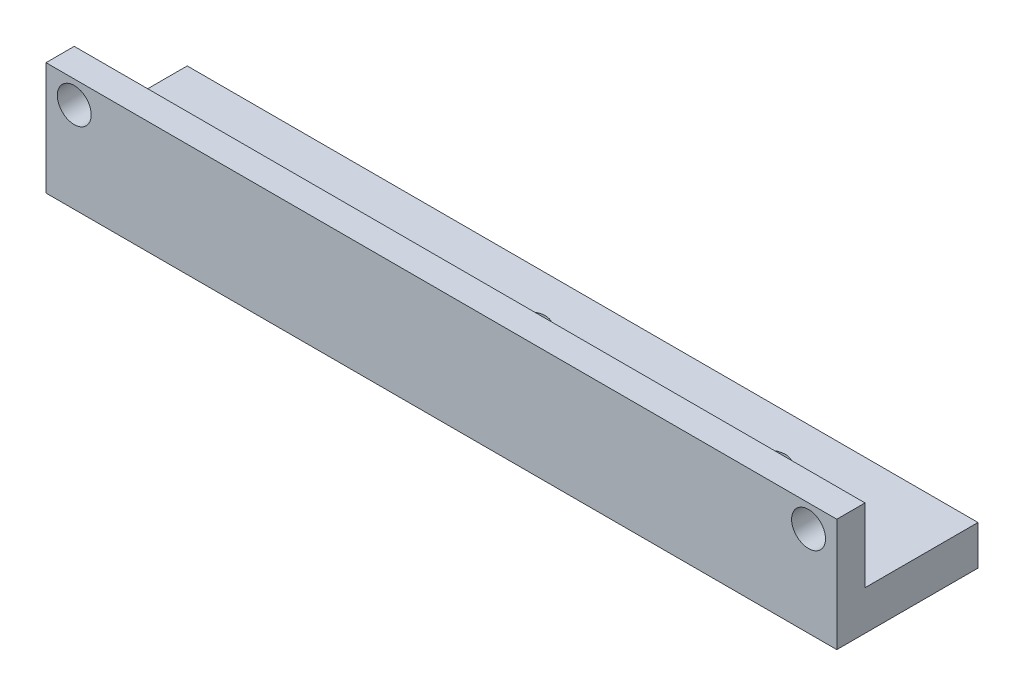
ISO-10303-21;
HEADER;
FILE_DESCRIPTION(('STEP AP214'),'2;1');
FILE_NAME('part.step','',(''),(''),'','','');
FILE_SCHEMA(('AUTOMOTIVE_DESIGN { 1 0 10303 214 1 1 1 1 }'));
ENDSEC;
DATA;
#1=APPLICATION_CONTEXT('core data for automotive mechanical design processes');
#2=APPLICATION_PROTOCOL_DEFINITION('international standard','automotive_design',2000,#1);
#3=PRODUCT_CONTEXT('',#1,'mechanical');
#4=PRODUCT('Part','Part','',(#3));
#5=PRODUCT_RELATED_PRODUCT_CATEGORY('part','',(#4));
#6=PRODUCT_DEFINITION_FORMATION('','',#4);
#7=PRODUCT_DEFINITION_CONTEXT('part definition',#1,'design');
#8=PRODUCT_DEFINITION('design','',#6,#7);
#9=PRODUCT_DEFINITION_SHAPE('','',#8);
#10=(LENGTH_UNIT() NAMED_UNIT(*) SI_UNIT(.MILLI.,.METRE.));
#11=(NAMED_UNIT(*) PLANE_ANGLE_UNIT() SI_UNIT($,.RADIAN.));
#12=(NAMED_UNIT(*) SI_UNIT($,.STERADIAN.) SOLID_ANGLE_UNIT());
#13=UNCERTAINTY_MEASURE_WITH_UNIT(LENGTH_MEASURE(1.E-05),#10,'distance_accuracy_value','');
#14=(GEOMETRIC_REPRESENTATION_CONTEXT(3) GLOBAL_UNCERTAINTY_ASSIGNED_CONTEXT((#13)) GLOBAL_UNIT_ASSIGNED_CONTEXT((#10,
#11,#12)) REPRESENTATION_CONTEXT('',''));
#15=CARTESIAN_POINT('',(0.,0.,0.));
#16=DIRECTION('',(0.,0.,1.));
#17=DIRECTION('',(1.,0.,0.));
#18=AXIS2_PLACEMENT_3D('',#15,#16,#17);
#19=CARTESIAN_POINT('',(0.,20.,-25.));
#20=DIRECTION('',(0.,0.,1.));
#21=DIRECTION('',(-1.,0.,0.));
#22=AXIS2_PLACEMENT_3D('',#19,#20,#21);
#23=PLANE('',#22);
#24=DIRECTION('',(1.,0.,0.));
#25=VECTOR('',#24,1.);
#26=CARTESIAN_POINT('',(-74.,-0.999999999999999,-25.));
#27=LINE('',#26,#25);
#28=CARTESIAN_POINT('',(-74.,-0.999999999999997,-25.));
#29=VERTEX_POINT('',#28);
#30=CARTESIAN_POINT('',(-66.,-0.999999999999999,-25.));
#31=VERTEX_POINT('',#30);
#32=EDGE_CURVE('E161',#29,#31,#27,.T.);
#33=ORIENTED_EDGE('',*,*,#32,.T.);
#34=DIRECTION('',(0.,1.,0.));
#35=VECTOR('',#34,1.);
#36=CARTESIAN_POINT('',(-66.,4.,-25.));
#37=LINE('',#36,#35);
#38=CARTESIAN_POINT('',(-66.,4.,-25.));
#39=VERTEX_POINT('',#38);
#40=EDGE_CURVE('E174',#31,#39,#37,.T.);
#41=ORIENTED_EDGE('',*,*,#40,.T.);
#42=DIRECTION('',(-1.,0.,0.));
#43=VECTOR('',#42,1.);
#44=CARTESIAN_POINT('',(-74.,4.,-25.));
#45=LINE('',#44,#43);
#46=CARTESIAN_POINT('',(-74.,4.,-25.));
#47=VERTEX_POINT('',#46);
#48=EDGE_CURVE('E170',#39,#47,#45,.T.);
#49=ORIENTED_EDGE('',*,*,#48,.T.);
#50=DIRECTION('',(0.,-1.,0.));
#51=VECTOR('',#50,1.);
#52=CARTESIAN_POINT('',(-74.,4.,-25.));
#53=LINE('',#52,#51);
#54=EDGE_CURVE('E184',#47,#29,#53,.T.);
#55=ORIENTED_EDGE('',*,*,#54,.T.);
#56=EDGE_LOOP('',(#33,#41,#49,#55));
#57=FACE_BOUND('',#56,.T.);
#58=DIRECTION('',(1.,0.,0.));
#59=VECTOR('',#58,1.);
#60=CARTESIAN_POINT('',(-31.5,-0.999999999999999,-25.));
#61=LINE('',#60,#59);
#62=CARTESIAN_POINT('',(-31.5,-0.999999999999997,-25.));
#63=VERTEX_POINT('',#62);
#64=CARTESIAN_POINT('',(-23.5,-0.999999999999999,-25.));
#65=VERTEX_POINT('',#64);
#66=EDGE_CURVE('E218',#63,#65,#61,.T.);
#67=ORIENTED_EDGE('',*,*,#66,.T.);
#68=DIRECTION('',(0.,1.,0.));
#69=VECTOR('',#68,1.);
#70=CARTESIAN_POINT('',(-23.5,4.,-25.));
#71=LINE('',#70,#69);
#72=CARTESIAN_POINT('',(-23.5,4.,-25.));
#73=VERTEX_POINT('',#72);
#74=EDGE_CURVE('E222',#65,#73,#71,.T.);
#75=ORIENTED_EDGE('',*,*,#74,.T.);
#76=DIRECTION('',(-1.,0.,0.));
#77=VECTOR('',#76,1.);
#78=CARTESIAN_POINT('',(-31.5,4.,-25.));
#79=LINE('',#78,#77);
#80=CARTESIAN_POINT('',(-31.5,4.,-25.));
#81=VERTEX_POINT('',#80);
#82=EDGE_CURVE('E205',#73,#81,#79,.T.);
#83=ORIENTED_EDGE('',*,*,#82,.T.);
#84=DIRECTION('',(0.,-1.,0.));
#85=VECTOR('',#84,1.);
#86=CARTESIAN_POINT('',(-31.5,4.,-25.));
#87=LINE('',#86,#85);
#88=EDGE_CURVE('E215',#81,#63,#87,.T.);
#89=ORIENTED_EDGE('',*,*,#88,.T.);
#90=EDGE_LOOP('',(#67,#75,#83,#89));
#91=FACE_BOUND('',#90,.T.);
#92=DIRECTION('',(1.,0.,0.));
#93=VECTOR('',#92,1.);
#94=CARTESIAN_POINT('',(0.,5.,-25.));
#95=LINE('',#94,#93);
#96=CARTESIAN_POINT('',(-140.,5.,-25.));
#97=VERTEX_POINT('',#96);
#98=CARTESIAN_POINT('',(0.,5.,-25.));
#99=VERTEX_POINT('',#98);
#100=EDGE_CURVE('E289',#97,#99,#95,.T.);
#101=ORIENTED_EDGE('',*,*,#100,.T.);
#102=DIRECTION('',(0.,-1.,0.));
#103=VECTOR('',#102,1.);
#104=CARTESIAN_POINT('',(0.,20.,-25.));
#105=LINE('',#104,#103);
#106=CARTESIAN_POINT('',(0.,-2.,-25.));
#107=VERTEX_POINT('',#106);
#108=EDGE_CURVE('E298',#99,#107,#105,.T.);
#109=ORIENTED_EDGE('',*,*,#108,.T.);
#110=DIRECTION('',(-1.,0.,0.));
#111=VECTOR('',#110,1.);
#112=CARTESIAN_POINT('',(-140.,-2.,-25.));
#113=LINE('',#112,#111);
#114=CARTESIAN_POINT('',(-140.,-2.,-25.));
#115=VERTEX_POINT('',#114);
#116=EDGE_CURVE('E249',#107,#115,#113,.T.);
#117=ORIENTED_EDGE('',*,*,#116,.T.);
#118=DIRECTION('',(0.,-1.,0.));
#119=VECTOR('',#118,1.);
#120=CARTESIAN_POINT('',(-140.,20.,-25.));
#121=LINE('',#120,#119);
#122=EDGE_CURVE('E305',#97,#115,#121,.T.);
#123=ORIENTED_EDGE('',*,*,#122,.F.);
#124=EDGE_LOOP('',(#101,#109,#117,#123));
#125=FACE_BOUND('',#124,.T.);
#126=ADVANCED_FACE('F41',(#57,#91,#125),#23,.F.);
#127=CARTESIAN_POINT('',(0.,20.,0.));
#128=DIRECTION('',(-1.,0.,0.));
#129=DIRECTION('',(0.,0.,-1.));
#130=AXIS2_PLACEMENT_3D('',#127,#128,#129);
#131=PLANE('',#130);
#132=DIRECTION('',(0.,-1.,0.));
#133=VECTOR('',#132,1.);
#134=CARTESIAN_POINT('',(0.,20.,0.));
#135=LINE('',#134,#133);
#136=CARTESIAN_POINT('',(0.,18.,0.));
#137=VERTEX_POINT('',#136);
#138=CARTESIAN_POINT('',(0.,-2.,0.));
#139=VERTEX_POINT('',#138);
#140=EDGE_CURVE('E11',#137,#139,#135,.T.);
#141=ORIENTED_EDGE('',*,*,#140,.T.);
#142=DIRECTION('',(0.,0.,-1.));
#143=VECTOR('',#142,1.);
#144=CARTESIAN_POINT('',(0.,-2.,0.));
#145=LINE('',#144,#143);
#146=EDGE_CURVE('E246',#139,#107,#145,.T.);
#147=ORIENTED_EDGE('',*,*,#146,.T.);
#148=ORIENTED_EDGE('',*,*,#108,.F.);
#149=DIRECTION('',(0.,0.,1.));
#150=VECTOR('',#149,1.);
#151=CARTESIAN_POINT('',(0.,5.,-25.));
#152=LINE('',#151,#150);
#153=CARTESIAN_POINT('',(0.,5.,-5.));
#154=VERTEX_POINT('',#153);
#155=EDGE_CURVE('E278',#99,#154,#152,.T.);
#156=ORIENTED_EDGE('',*,*,#155,.T.);
#157=DIRECTION('',(0.,1.,0.));
#158=VECTOR('',#157,1.);
#159=CARTESIAN_POINT('',(0.,5.,-5.));
#160=LINE('',#159,#158);
#161=CARTESIAN_POINT('',(0.,18.,-5.));
#162=VERTEX_POINT('',#161);
#163=EDGE_CURVE('E293',#154,#162,#160,.T.);
#164=ORIENTED_EDGE('',*,*,#163,.T.);
#165=DIRECTION('',(0.,0.,-1.));
#166=VECTOR('',#165,1.);
#167=CARTESIAN_POINT('',(0.,18.,10.));
#168=LINE('',#167,#166);
#169=EDGE_CURVE('E257',#137,#162,#168,.T.);
#170=ORIENTED_EDGE('',*,*,#169,.F.);
#171=EDGE_LOOP('',(#141,#147,#148,#156,#164,#170));
#172=FACE_BOUND('',#171,.T.);
#173=ADVANCED_FACE('F43',(#172),#131,.F.);
#174=CARTESIAN_POINT('',(0.,20.,0.));
#175=DIRECTION('',(0.,0.,-1.));
#176=DIRECTION('',(1.,0.,0.));
#177=AXIS2_PLACEMENT_3D('',#174,#175,#176);
#178=PLANE('',#177);
#179=CARTESIAN_POINT('',(-5.,14.,0.));
#180=DIRECTION('',(0.,0.,-1.));
#181=DIRECTION('',(-1.,0.,0.));
#182=AXIS2_PLACEMENT_3D('',#179,#180,#181);
#183=CIRCLE('',#182,3.);
#184=CARTESIAN_POINT('',(-8.,14.,0.));
#185=VERTEX_POINT('',#184);
#186=EDGE_CURVE('E268',#185,#185,#183,.T.);
#187=ORIENTED_EDGE('',*,*,#186,.T.);
#188=EDGE_LOOP('',(#187));
#189=FACE_BOUND('',#188,.T.);
#190=CARTESIAN_POINT('',(-135.,14.,0.));
#191=DIRECTION('',(0.,0.,-1.));
#192=DIRECTION('',(-1.,0.,0.));
#193=AXIS2_PLACEMENT_3D('',#190,#191,#192);
#194=CIRCLE('',#193,2.99999999999999);
#195=CARTESIAN_POINT('',(-138.,14.,0.));
#196=VERTEX_POINT('',#195);
#197=EDGE_CURVE('E273',#196,#196,#194,.T.);
#198=ORIENTED_EDGE('',*,*,#197,.T.);
#199=EDGE_LOOP('',(#198));
#200=FACE_BOUND('',#199,.T.);
#201=DIRECTION('',(0.,-1.,0.));
#202=VECTOR('',#201,1.);
#203=CARTESIAN_POINT('',(-140.,20.,0.));
#204=LINE('',#203,#202);
#205=CARTESIAN_POINT('',(-140.,18.,0.));
#206=VERTEX_POINT('',#205);
#207=CARTESIAN_POINT('',(-140.,-2.,0.));
#208=VERTEX_POINT('',#207);
#209=EDGE_CURVE('E51',#206,#208,#204,.T.);
#210=ORIENTED_EDGE('',*,*,#209,.T.);
#211=DIRECTION('',(1.,0.,0.));
#212=VECTOR('',#211,1.);
#213=CARTESIAN_POINT('',(-140.,-2.,0.));
#214=LINE('',#213,#212);
#215=EDGE_CURVE('E242',#208,#139,#214,.T.);
#216=ORIENTED_EDGE('',*,*,#215,.T.);
#217=ORIENTED_EDGE('',*,*,#140,.F.);
#218=DIRECTION('',(1.,0.,0.));
#219=VECTOR('',#218,1.);
#220=CARTESIAN_POINT('',(0.,18.,0.));
#221=LINE('',#220,#219);
#222=EDGE_CURVE('E261',#206,#137,#221,.T.);
#223=ORIENTED_EDGE('',*,*,#222,.F.);
#224=EDGE_LOOP('',(#210,#216,#217,#223));
#225=FACE_BOUND('',#224,.T.);
#226=ADVANCED_FACE('F372',(#189,#200,#225),#178,.F.);
#227=CARTESIAN_POINT('',(-140.,20.,0.));
#228=DIRECTION('',(1.,0.,0.));
#229=DIRECTION('',(0.,0.,1.));
#230=AXIS2_PLACEMENT_3D('',#227,#228,#229);
#231=PLANE('',#230);
#232=DIRECTION('',(0.,1.,0.));
#233=VECTOR('',#232,1.);
#234=CARTESIAN_POINT('',(-140.,5.,-5.));
#235=LINE('',#234,#233);
#236=CARTESIAN_POINT('',(-140.,5.,-5.));
#237=VERTEX_POINT('',#236);
#238=CARTESIAN_POINT('',(-140.,18.,-5.));
#239=VERTEX_POINT('',#238);
#240=EDGE_CURVE('E294',#237,#239,#235,.T.);
#241=ORIENTED_EDGE('',*,*,#240,.F.);
#242=DIRECTION('',(0.,0.,-1.));
#243=VECTOR('',#242,1.);
#244=CARTESIAN_POINT('',(-140.,5.,-25.));
#245=LINE('',#244,#243);
#246=EDGE_CURVE('E286',#237,#97,#245,.T.);
#247=ORIENTED_EDGE('',*,*,#246,.T.);
#248=ORIENTED_EDGE('',*,*,#122,.T.);
#249=DIRECTION('',(0.,0.,1.));
#250=VECTOR('',#249,1.);
#251=CARTESIAN_POINT('',(-140.,-2.,0.));
#252=LINE('',#251,#250);
#253=EDGE_CURVE('E239',#115,#208,#252,.T.);
#254=ORIENTED_EDGE('',*,*,#253,.T.);
#255=ORIENTED_EDGE('',*,*,#209,.F.);
#256=DIRECTION('',(0.,0.,-1.));
#257=VECTOR('',#256,1.);
#258=CARTESIAN_POINT('',(-140.,18.,10.));
#259=LINE('',#258,#257);
#260=EDGE_CURVE('E256',#206,#239,#259,.T.);
#261=ORIENTED_EDGE('',*,*,#260,.T.);
#262=EDGE_LOOP('',(#241,#247,#248,#254,#255,#261));
#263=FACE_BOUND('',#262,.T.);
#264=ADVANCED_FACE('F362',(#263),#231,.F.);
#265=CARTESIAN_POINT('',(0.,5.,-5.));
#266=DIRECTION('',(0.,0.,1.));
#267=DIRECTION('',(-1.,0.,0.));
#268=AXIS2_PLACEMENT_3D('',#265,#266,#267);
#269=PLANE('',#268);
#270=CARTESIAN_POINT('',(-5.,14.,-5.));
#271=DIRECTION('',(0.,0.,-1.));
#272=DIRECTION('',(-1.,0.,0.));
#273=AXIS2_PLACEMENT_3D('',#270,#271,#272);
#274=CIRCLE('',#273,3.);
#275=CARTESIAN_POINT('',(-8.,14.,-5.));
#276=VERTEX_POINT('',#275);
#277=EDGE_CURVE('E283',#276,#276,#274,.T.);
#278=ORIENTED_EDGE('',*,*,#277,.F.);
#279=EDGE_LOOP('',(#278));
#280=FACE_BOUND('',#279,.T.);
#281=CARTESIAN_POINT('',(-135.,14.,-5.));
#282=DIRECTION('',(0.,0.,-1.));
#283=DIRECTION('',(-1.,0.,0.));
#284=AXIS2_PLACEMENT_3D('',#281,#282,#283);
#285=CIRCLE('',#284,2.99999999999999);
#286=CARTESIAN_POINT('',(-138.,14.,-5.));
#287=VERTEX_POINT('',#286);
#288=EDGE_CURVE('E272',#287,#287,#285,.T.);
#289=ORIENTED_EDGE('',*,*,#288,.F.);
#290=EDGE_LOOP('',(#289));
#291=FACE_BOUND('',#290,.T.);
#292=ORIENTED_EDGE('',*,*,#163,.F.);
#293=DIRECTION('',(-1.,0.,0.));
#294=VECTOR('',#293,1.);
#295=CARTESIAN_POINT('',(0.,5.,-5.));
#296=LINE('',#295,#294);
#297=EDGE_CURVE('E282',#154,#237,#296,.T.);
#298=ORIENTED_EDGE('',*,*,#297,.T.);
#299=ORIENTED_EDGE('',*,*,#240,.T.);
#300=DIRECTION('',(1.,0.,0.));
#301=VECTOR('',#300,1.);
#302=CARTESIAN_POINT('',(-140.,18.,-5.));
#303=LINE('',#302,#301);
#304=EDGE_CURVE('E253',#239,#162,#303,.T.);
#305=ORIENTED_EDGE('',*,*,#304,.T.);
#306=EDGE_LOOP('',(#292,#298,#299,#305));
#307=FACE_BOUND('',#306,.T.);
#308=ADVANCED_FACE('F376',(#280,#291,#307),#269,.F.);
#309=CARTESIAN_POINT('',(0.,5.,0.));
#310=DIRECTION('',(0.,1.,0.));
#311=DIRECTION('',(0.,0.,1.));
#312=AXIS2_PLACEMENT_3D('',#309,#310,#311);
#313=PLANE('',#312);
#314=CARTESIAN_POINT('',(-70.,5.,-15.4));
#315=DIRECTION('',(0.,-1.,0.));
#316=DIRECTION('',(0.,0.,1.));
#317=AXIS2_PLACEMENT_3D('',#314,#315,#316);
#318=CIRCLE('',#317,3.00000000000001);
#319=CARTESIAN_POINT('',(-70.,5.,-12.4));
#320=VERTEX_POINT('',#319);
#321=EDGE_CURVE('E277',#320,#320,#318,.T.);
#322=ORIENTED_EDGE('',*,*,#321,.T.);
#323=EDGE_LOOP('',(#322));
#324=FACE_BOUND('',#323,.T.);
#325=CARTESIAN_POINT('',(-27.5,5.,-15.4));
#326=DIRECTION('',(0.,-1.,0.));
#327=DIRECTION('',(0.,0.,1.));
#328=AXIS2_PLACEMENT_3D('',#325,#326,#327);
#329=CIRCLE('',#328,3.);
#330=CARTESIAN_POINT('',(-27.5,5.,-12.4));
#331=VERTEX_POINT('',#330);
#332=EDGE_CURVE('E267',#331,#331,#329,.T.);
#333=ORIENTED_EDGE('',*,*,#332,.T.);
#334=EDGE_LOOP('',(#333));
#335=FACE_BOUND('',#334,.T.);
#336=ORIENTED_EDGE('',*,*,#155,.F.);
#337=ORIENTED_EDGE('',*,*,#100,.F.);
#338=ORIENTED_EDGE('',*,*,#246,.F.);
#339=ORIENTED_EDGE('',*,*,#297,.F.);
#340=EDGE_LOOP('',(#336,#337,#338,#339));
#341=FACE_BOUND('',#340,.T.);
#342=ADVANCED_FACE('F378',(#324,#335,#341),#313,.T.);
#343=CARTESIAN_POINT('',(-135.,14.,-15.));
#344=DIRECTION('',(0.,0.,1.));
#345=DIRECTION('',(-1.,0.,0.));
#346=AXIS2_PLACEMENT_3D('',#343,#344,#345);
#347=CYLINDRICAL_SURFACE('',#346,2.99999999999999);
#348=ORIENTED_EDGE('',*,*,#197,.F.);
#349=EDGE_LOOP('',(#348));
#350=FACE_BOUND('',#349,.T.);
#351=ORIENTED_EDGE('',*,*,#288,.T.);
#352=EDGE_LOOP('',(#351));
#353=FACE_BOUND('',#352,.T.);
#354=ADVANCED_FACE('F380',(#350,#353),#347,.F.);
#355=CARTESIAN_POINT('',(-5.,14.,-15.));
#356=DIRECTION('',(0.,0.,1.));
#357=DIRECTION('',(-1.,0.,0.));
#358=AXIS2_PLACEMENT_3D('',#355,#356,#357);
#359=CYLINDRICAL_SURFACE('',#358,3.);
#360=ORIENTED_EDGE('',*,*,#186,.F.);
#361=EDGE_LOOP('',(#360));
#362=FACE_BOUND('',#361,.T.);
#363=ORIENTED_EDGE('',*,*,#277,.T.);
#364=EDGE_LOOP('',(#363));
#365=FACE_BOUND('',#364,.T.);
#366=ADVANCED_FACE('F387',(#362,#365),#359,.F.);
#367=CARTESIAN_POINT('',(-27.5,0.,-15.4));
#368=DIRECTION('',(0.,1.,0.));
#369=DIRECTION('',(0.,0.,1.));
#370=AXIS2_PLACEMENT_3D('',#367,#368,#369);
#371=CYLINDRICAL_SURFACE('',#370,3.);
#372=CARTESIAN_POINT('',(-27.5,4.,-15.4));
#373=DIRECTION('',(0.,-1.,0.));
#374=DIRECTION('',(0.,0.,1.));
#375=AXIS2_PLACEMENT_3D('',#372,#373,#374);
#376=CIRCLE('',#375,3.);
#377=CARTESIAN_POINT('',(-27.5,4.,-12.4));
#378=VERTEX_POINT('',#377);
#379=EDGE_CURVE('E243',#378,#378,#376,.F.);
#380=ORIENTED_EDGE('',*,*,#379,.F.);
#381=EDGE_LOOP('',(#380));
#382=FACE_BOUND('',#381,.T.);
#383=ORIENTED_EDGE('',*,*,#332,.F.);
#384=EDGE_LOOP('',(#383));
#385=FACE_BOUND('',#384,.T.);
#386=ADVANCED_FACE('F415',(#382,#385),#371,.F.);
#387=CARTESIAN_POINT('',(-70.,0.,-15.4));
#388=DIRECTION('',(0.,1.,0.));
#389=DIRECTION('',(0.,0.,1.));
#390=AXIS2_PLACEMENT_3D('',#387,#388,#389);
#391=CYLINDRICAL_SURFACE('',#390,3.00000000000001);
#392=CARTESIAN_POINT('',(-70.,4.,-15.4));
#393=DIRECTION('',(0.,-1.,0.));
#394=DIRECTION('',(0.,0.,1.));
#395=AXIS2_PLACEMENT_3D('',#392,#393,#394);
#396=CIRCLE('',#395,3.00000000000001);
#397=CARTESIAN_POINT('',(-70.,4.,-12.4));
#398=VERTEX_POINT('',#397);
#399=EDGE_CURVE('E195',#398,#398,#396,.F.);
#400=ORIENTED_EDGE('',*,*,#399,.F.);
#401=EDGE_LOOP('',(#400));
#402=FACE_BOUND('',#401,.T.);
#403=ORIENTED_EDGE('',*,*,#321,.F.);
#404=EDGE_LOOP('',(#403));
#405=FACE_BOUND('',#404,.T.);
#406=ADVANCED_FACE('F421',(#402,#405),#391,.F.);
#407=CARTESIAN_POINT('',(-140.,18.,10.));
#408=DIRECTION('',(0.,-1.,0.));
#409=DIRECTION('',(0.,0.,-1.));
#410=AXIS2_PLACEMENT_3D('',#407,#408,#409);
#411=PLANE('',#410);
#412=ORIENTED_EDGE('',*,*,#260,.F.);
#413=ORIENTED_EDGE('',*,*,#222,.T.);
#414=ORIENTED_EDGE('',*,*,#169,.T.);
#415=ORIENTED_EDGE('',*,*,#304,.F.);
#416=EDGE_LOOP('',(#412,#413,#414,#415));
#417=FACE_BOUND('',#416,.T.);
#418=ADVANCED_FACE('F352',(#417),#411,.F.);
#419=CARTESIAN_POINT('',(0.,-2.,0.));
#420=DIRECTION('',(0.,1.,0.));
#421=DIRECTION('',(0.,0.,1.));
#422=AXIS2_PLACEMENT_3D('',#419,#420,#421);
#423=PLANE('',#422);
#424=CARTESIAN_POINT('',(-27.5,-2.,-15.4));
#425=DIRECTION('',(0.,-1.,0.));
#426=DIRECTION('',(0.,0.,1.));
#427=AXIS2_PLACEMENT_3D('',#424,#425,#426);
#428=CIRCLE('',#427,3.);
#429=CARTESIAN_POINT('',(-27.5,-2.,-12.4));
#430=VERTEX_POINT('',#429);
#431=EDGE_CURVE('E332',#430,#430,#428,.T.);
#432=ORIENTED_EDGE('',*,*,#431,.F.);
#433=EDGE_LOOP('',(#432));
#434=FACE_BOUND('',#433,.T.);
#435=CARTESIAN_POINT('',(-70.,-2.,-15.4));
#436=DIRECTION('',(0.,-1.,0.));
#437=DIRECTION('',(0.,0.,1.));
#438=AXIS2_PLACEMENT_3D('',#435,#436,#437);
#439=CIRCLE('',#438,3.00000000000001);
#440=CARTESIAN_POINT('',(-70.,-2.,-12.4));
#441=VERTEX_POINT('',#440);
#442=EDGE_CURVE('E177',#441,#441,#439,.T.);
#443=ORIENTED_EDGE('',*,*,#442,.F.);
#444=EDGE_LOOP('',(#443));
#445=FACE_BOUND('',#444,.T.);
#446=ORIENTED_EDGE('',*,*,#253,.F.);
#447=ORIENTED_EDGE('',*,*,#116,.F.);
#448=ORIENTED_EDGE('',*,*,#146,.F.);
#449=ORIENTED_EDGE('',*,*,#215,.F.);
#450=EDGE_LOOP('',(#446,#447,#448,#449));
#451=FACE_BOUND('',#450,.T.);
#452=ADVANCED_FACE('F348',(#434,#445,#451),#423,.F.);
#453=CARTESIAN_POINT('',(-74.,4.,-9.));
#454=DIRECTION('',(0.,1.,0.));
#455=DIRECTION('',(0.,0.,1.));
#456=AXIS2_PLACEMENT_3D('',#453,#454,#455);
#457=PLANE('',#456);
#458=ORIENTED_EDGE('',*,*,#48,.F.);
#459=DIRECTION('',(0.,0.,-1.));
#460=VECTOR('',#459,1.);
#461=CARTESIAN_POINT('',(-66.,4.,-9.));
#462=LINE('',#461,#460);
#463=CARTESIAN_POINT('',(-66.,4.,-9.));
#464=VERTEX_POINT('',#463);
#465=EDGE_CURVE('E196',#464,#39,#462,.T.);
#466=ORIENTED_EDGE('',*,*,#465,.F.);
#467=DIRECTION('',(-1.,0.,0.));
#468=VECTOR('',#467,1.);
#469=CARTESIAN_POINT('',(-74.,4.,-9.));
#470=LINE('',#469,#468);
#471=CARTESIAN_POINT('',(-74.,4.,-9.));
#472=VERTEX_POINT('',#471);
#473=EDGE_CURVE('E164',#464,#472,#470,.T.);
#474=ORIENTED_EDGE('',*,*,#473,.T.);
#475=DIRECTION('',(0.,0.,-1.));
#476=VECTOR('',#475,1.);
#477=CARTESIAN_POINT('',(-74.,4.,-9.));
#478=LINE('',#477,#476);
#479=EDGE_CURVE('E167',#472,#47,#478,.T.);
#480=ORIENTED_EDGE('',*,*,#479,.T.);
#481=EDGE_LOOP('',(#458,#466,#474,#480));
#482=FACE_BOUND('',#481,.T.);
#483=ORIENTED_EDGE('',*,*,#399,.T.);
#484=EDGE_LOOP('',(#483));
#485=FACE_BOUND('',#484,.T.);
#486=ADVANCED_FACE('F351',(#482,#485),#457,.F.);
#487=CARTESIAN_POINT('',(-74.,4.,-9.));
#488=DIRECTION('',(-1.,0.,0.));
#489=DIRECTION('',(0.,0.,-1.));
#490=AXIS2_PLACEMENT_3D('',#487,#488,#489);
#491=PLANE('',#490);
#492=ORIENTED_EDGE('',*,*,#54,.F.);
#493=ORIENTED_EDGE('',*,*,#479,.F.);
#494=DIRECTION('',(0.,-1.,0.));
#495=VECTOR('',#494,1.);
#496=CARTESIAN_POINT('',(-74.,4.,-9.));
#497=LINE('',#496,#495);
#498=CARTESIAN_POINT('',(-74.,-0.999999999999999,-9.));
#499=VERTEX_POINT('',#498);
#500=EDGE_CURVE('E151',#472,#499,#497,.T.);
#501=ORIENTED_EDGE('',*,*,#500,.T.);
#502=DIRECTION('',(0.,0.,-1.));
#503=VECTOR('',#502,1.);
#504=CARTESIAN_POINT('',(-74.,-0.999999999999999,-9.));
#505=LINE('',#504,#503);
#506=EDGE_CURVE('E59',#499,#29,#505,.T.);
#507=ORIENTED_EDGE('',*,*,#506,.T.);
#508=EDGE_LOOP('',(#492,#493,#501,#507));
#509=FACE_BOUND('',#508,.T.);
#510=ADVANCED_FACE('F166',(#509),#491,.F.);
#511=CARTESIAN_POINT('',(-66.,4.,-9.));
#512=DIRECTION('',(1.,0.,0.));
#513=DIRECTION('',(0.,0.,1.));
#514=AXIS2_PLACEMENT_3D('',#511,#512,#513);
#515=PLANE('',#514);
#516=ORIENTED_EDGE('',*,*,#40,.F.);
#517=DIRECTION('',(0.,0.,-1.));
#518=VECTOR('',#517,1.);
#519=CARTESIAN_POINT('',(-66.,-0.999999999999999,-9.));
#520=LINE('',#519,#518);
#521=CARTESIAN_POINT('',(-66.,-0.999999999999999,-9.));
#522=VERTEX_POINT('',#521);
#523=EDGE_CURVE('E163',#522,#31,#520,.T.);
#524=ORIENTED_EDGE('',*,*,#523,.F.);
#525=DIRECTION('',(0.,1.,0.));
#526=VECTOR('',#525,1.);
#527=CARTESIAN_POINT('',(-66.,4.,-9.));
#528=LINE('',#527,#526);
#529=EDGE_CURVE('E153',#522,#464,#528,.T.);
#530=ORIENTED_EDGE('',*,*,#529,.T.);
#531=ORIENTED_EDGE('',*,*,#465,.T.);
#532=EDGE_LOOP('',(#516,#524,#530,#531));
#533=FACE_BOUND('',#532,.T.);
#534=ADVANCED_FACE('F452',(#533),#515,.F.);
#535=CARTESIAN_POINT('',(-74.,-0.999999999999999,-9.));
#536=DIRECTION('',(0.,-1.,0.));
#537=DIRECTION('',(0.,0.,-1.));
#538=AXIS2_PLACEMENT_3D('',#535,#536,#537);
#539=PLANE('',#538);
#540=CARTESIAN_POINT('',(-70.,-0.999999999999999,-15.4));
#541=DIRECTION('',(0.,1.,0.));
#542=DIRECTION('',(0.,0.,-1.));
#543=AXIS2_PLACEMENT_3D('',#540,#541,#542);
#544=CIRCLE('',#543,3.00000000000001);
#545=CARTESIAN_POINT('',(-70.,-0.999999999999999,-18.4));
#546=VERTEX_POINT('',#545);
#547=EDGE_CURVE('E45',#546,#546,#544,.T.);
#548=ORIENTED_EDGE('',*,*,#547,.F.);
#549=EDGE_LOOP('',(#548));
#550=FACE_BOUND('',#549,.T.);
#551=ORIENTED_EDGE('',*,*,#32,.F.);
#552=ORIENTED_EDGE('',*,*,#506,.F.);
#553=DIRECTION('',(1.,0.,0.));
#554=VECTOR('',#553,1.);
#555=CARTESIAN_POINT('',(-74.,-0.999999999999999,-9.));
#556=LINE('',#555,#554);
#557=EDGE_CURVE('E148',#499,#522,#556,.T.);
#558=ORIENTED_EDGE('',*,*,#557,.T.);
#559=ORIENTED_EDGE('',*,*,#523,.T.);
#560=EDGE_LOOP('',(#551,#552,#558,#559));
#561=FACE_BOUND('',#560,.T.);
#562=ADVANCED_FACE('F159',(#550,#561),#539,.F.);
#563=CARTESIAN_POINT('',(0.,0.,-9.));
#564=DIRECTION('',(0.,0.,-1.));
#565=DIRECTION('',(1.,0.,0.));
#566=AXIS2_PLACEMENT_3D('',#563,#564,#565);
#567=PLANE('',#566);
#568=ORIENTED_EDGE('',*,*,#500,.F.);
#569=ORIENTED_EDGE('',*,*,#473,.F.);
#570=ORIENTED_EDGE('',*,*,#529,.F.);
#571=ORIENTED_EDGE('',*,*,#557,.F.);
#572=EDGE_LOOP('',(#568,#569,#570,#571));
#573=FACE_BOUND('',#572,.T.);
#574=ADVANCED_FACE('F149',(#573),#567,.T.);
#575=CARTESIAN_POINT('',(-31.5,4.,-9.));
#576=DIRECTION('',(0.,1.,0.));
#577=DIRECTION('',(0.,0.,1.));
#578=AXIS2_PLACEMENT_3D('',#575,#576,#577);
#579=PLANE('',#578);
#580=ORIENTED_EDGE('',*,*,#82,.F.);
#581=DIRECTION('',(0.,0.,-1.));
#582=VECTOR('',#581,1.);
#583=CARTESIAN_POINT('',(-23.5,4.,-9.));
#584=LINE('',#583,#582);
#585=CARTESIAN_POINT('',(-23.5,4.,-9.));
#586=VERTEX_POINT('',#585);
#587=EDGE_CURVE('E231',#586,#73,#584,.T.);
#588=ORIENTED_EDGE('',*,*,#587,.F.);
#589=DIRECTION('',(-1.,0.,0.));
#590=VECTOR('',#589,1.);
#591=CARTESIAN_POINT('',(-31.5,4.,-9.));
#592=LINE('',#591,#590);
#593=CARTESIAN_POINT('',(-31.5,4.,-9.));
#594=VERTEX_POINT('',#593);
#595=EDGE_CURVE('E211',#586,#594,#592,.T.);
#596=ORIENTED_EDGE('',*,*,#595,.T.);
#597=DIRECTION('',(0.,0.,-1.));
#598=VECTOR('',#597,1.);
#599=CARTESIAN_POINT('',(-31.5,4.,-9.));
#600=LINE('',#599,#598);
#601=EDGE_CURVE('E187',#594,#81,#600,.T.);
#602=ORIENTED_EDGE('',*,*,#601,.T.);
#603=EDGE_LOOP('',(#580,#588,#596,#602));
#604=FACE_BOUND('',#603,.T.);
#605=ORIENTED_EDGE('',*,*,#379,.T.);
#606=EDGE_LOOP('',(#605));
#607=FACE_BOUND('',#606,.T.);
#608=ADVANCED_FACE('F434',(#604,#607),#579,.F.);
#609=CARTESIAN_POINT('',(-31.5,4.,-9.));
#610=DIRECTION('',(-1.,0.,0.));
#611=DIRECTION('',(0.,0.,-1.));
#612=AXIS2_PLACEMENT_3D('',#609,#610,#611);
#613=PLANE('',#612);
#614=ORIENTED_EDGE('',*,*,#88,.F.);
#615=ORIENTED_EDGE('',*,*,#601,.F.);
#616=DIRECTION('',(0.,-1.,0.));
#617=VECTOR('',#616,1.);
#618=CARTESIAN_POINT('',(-31.5,4.,-9.));
#619=LINE('',#618,#617);
#620=CARTESIAN_POINT('',(-31.5,-0.999999999999999,-9.));
#621=VERTEX_POINT('',#620);
#622=EDGE_CURVE('E201',#594,#621,#619,.T.);
#623=ORIENTED_EDGE('',*,*,#622,.T.);
#624=DIRECTION('',(0.,0.,-1.));
#625=VECTOR('',#624,1.);
#626=CARTESIAN_POINT('',(-31.5,-0.999999999999999,-9.));
#627=LINE('',#626,#625);
#628=EDGE_CURVE('E67',#621,#63,#627,.T.);
#629=ORIENTED_EDGE('',*,*,#628,.T.);
#630=EDGE_LOOP('',(#614,#615,#623,#629));
#631=FACE_BOUND('',#630,.T.);
#632=ADVANCED_FACE('F430',(#631),#613,.F.);
#633=CARTESIAN_POINT('',(-23.5,4.,-9.));
#634=DIRECTION('',(1.,0.,0.));
#635=DIRECTION('',(0.,0.,1.));
#636=AXIS2_PLACEMENT_3D('',#633,#634,#635);
#637=PLANE('',#636);
#638=ORIENTED_EDGE('',*,*,#74,.F.);
#639=DIRECTION('',(0.,0.,-1.));
#640=VECTOR('',#639,1.);
#641=CARTESIAN_POINT('',(-23.5,-0.999999999999999,-9.));
#642=LINE('',#641,#640);
#643=CARTESIAN_POINT('',(-23.5,-0.999999999999999,-9.));
#644=VERTEX_POINT('',#643);
#645=EDGE_CURVE('E234',#644,#65,#642,.T.);
#646=ORIENTED_EDGE('',*,*,#645,.F.);
#647=DIRECTION('',(0.,1.,0.));
#648=VECTOR('',#647,1.);
#649=CARTESIAN_POINT('',(-23.5,4.,-9.));
#650=LINE('',#649,#648);
#651=EDGE_CURVE('E208',#644,#586,#650,.T.);
#652=ORIENTED_EDGE('',*,*,#651,.T.);
#653=ORIENTED_EDGE('',*,*,#587,.T.);
#654=EDGE_LOOP('',(#638,#646,#652,#653));
#655=FACE_BOUND('',#654,.T.);
#656=ADVANCED_FACE('F433',(#655),#637,.F.);
#657=CARTESIAN_POINT('',(-31.5,-0.999999999999999,-9.));
#658=DIRECTION('',(0.,-1.,0.));
#659=DIRECTION('',(0.,0.,-1.));
#660=AXIS2_PLACEMENT_3D('',#657,#658,#659);
#661=PLANE('',#660);
#662=CARTESIAN_POINT('',(-27.5,-0.999999999999999,-15.4));
#663=DIRECTION('',(0.,1.,0.));
#664=DIRECTION('',(0.,0.,-1.));
#665=AXIS2_PLACEMENT_3D('',#662,#663,#664);
#666=CIRCLE('',#665,3.);
#667=CARTESIAN_POINT('',(-27.5,-0.999999999999999,-18.4));
#668=VERTEX_POINT('',#667);
#669=EDGE_CURVE('E329',#668,#668,#666,.T.);
#670=ORIENTED_EDGE('',*,*,#669,.F.);
#671=EDGE_LOOP('',(#670));
#672=FACE_BOUND('',#671,.T.);
#673=ORIENTED_EDGE('',*,*,#66,.F.);
#674=ORIENTED_EDGE('',*,*,#628,.F.);
#675=DIRECTION('',(1.,0.,0.));
#676=VECTOR('',#675,1.);
#677=CARTESIAN_POINT('',(-31.5,-0.999999999999999,-9.));
#678=LINE('',#677,#676);
#679=EDGE_CURVE('E204',#621,#644,#678,.T.);
#680=ORIENTED_EDGE('',*,*,#679,.T.);
#681=ORIENTED_EDGE('',*,*,#645,.T.);
#682=EDGE_LOOP('',(#673,#674,#680,#681));
#683=FACE_BOUND('',#682,.T.);
#684=ADVANCED_FACE('F435',(#672,#683),#661,.F.);
#685=CARTESIAN_POINT('',(0.,0.,-9.));
#686=DIRECTION('',(0.,0.,-1.));
#687=DIRECTION('',(1.,0.,0.));
#688=AXIS2_PLACEMENT_3D('',#685,#686,#687);
#689=PLANE('',#688);
#690=ORIENTED_EDGE('',*,*,#622,.F.);
#691=ORIENTED_EDGE('',*,*,#595,.F.);
#692=ORIENTED_EDGE('',*,*,#651,.F.);
#693=ORIENTED_EDGE('',*,*,#679,.F.);
#694=EDGE_LOOP('',(#690,#691,#692,#693));
#695=FACE_BOUND('',#694,.T.);
#696=ADVANCED_FACE('F438',(#695),#689,.T.);
#697=CARTESIAN_POINT('',(-27.5,-2.,-15.4));
#698=DIRECTION('',(0.,1.,0.));
#699=DIRECTION('',(0.,0.,1.));
#700=AXIS2_PLACEMENT_3D('',#697,#698,#699);
#701=CYLINDRICAL_SURFACE('',#700,3.);
#702=ORIENTED_EDGE('',*,*,#431,.T.);
#703=EDGE_LOOP('',(#702));
#704=FACE_BOUND('',#703,.T.);
#705=ORIENTED_EDGE('',*,*,#669,.T.);
#706=EDGE_LOOP('',(#705));
#707=FACE_BOUND('',#706,.T.);
#708=ADVANCED_FACE('F448',(#704,#707),#701,.F.);
#709=CARTESIAN_POINT('',(-70.,-2.,-15.4));
#710=DIRECTION('',(0.,1.,0.));
#711=DIRECTION('',(0.,0.,1.));
#712=AXIS2_PLACEMENT_3D('',#709,#710,#711);
#713=CYLINDRICAL_SURFACE('',#712,3.00000000000001);
#714=ORIENTED_EDGE('',*,*,#442,.T.);
#715=EDGE_LOOP('',(#714));
#716=FACE_BOUND('',#715,.T.);
#717=ORIENTED_EDGE('',*,*,#547,.T.);
#718=EDGE_LOOP('',(#717));
#719=FACE_BOUND('',#718,.T.);
#720=ADVANCED_FACE('F345',(#716,#719),#713,.F.);
#721=CLOSED_SHELL('',(#126,#173,#226,#264,#308,#342,#354,#366,#386,#406,#418,#452,#486,#510,
#534,#562,#574,#608,#632,#656,#684,#696,#708,#720));
#722=MANIFOLD_SOLID_BREP('B2',#721);
#723=ADVANCED_BREP_SHAPE_REPRESENTATION('',(#18,#722),#14);
#724=SHAPE_DEFINITION_REPRESENTATION(#9,#723);
ENDSEC;
END-ISO-10303-21;
